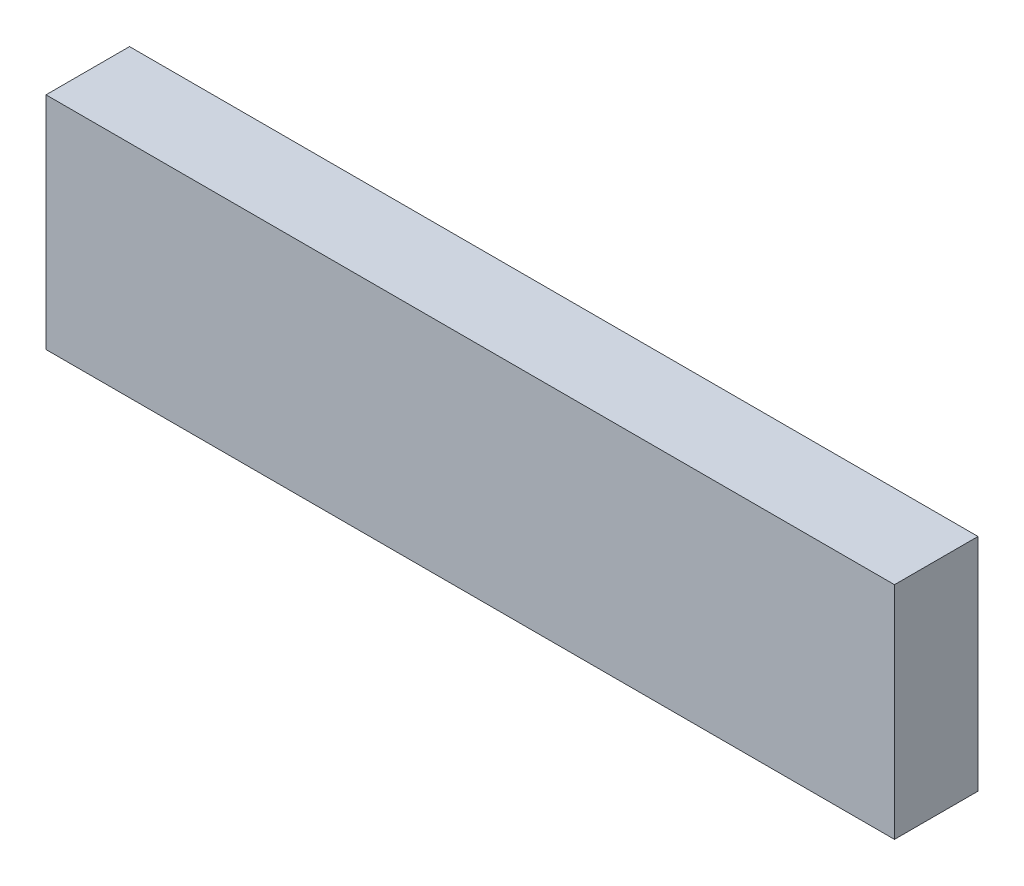
ISO-10303-21;
HEADER;
FILE_DESCRIPTION(('STEP AP214'),'2;1');
FILE_NAME('part.step','',(''),(''),'','','');
FILE_SCHEMA(('AUTOMOTIVE_DESIGN { 1 0 10303 214 1 1 1 1 }'));
ENDSEC;
DATA;
#1=APPLICATION_CONTEXT('core data for automotive mechanical design processes');
#2=APPLICATION_PROTOCOL_DEFINITION('international standard','automotive_design',2000,#1);
#3=PRODUCT_CONTEXT('',#1,'mechanical');
#4=PRODUCT('Part','Part','',(#3));
#5=PRODUCT_RELATED_PRODUCT_CATEGORY('part','',(#4));
#6=PRODUCT_DEFINITION_FORMATION('','',#4);
#7=PRODUCT_DEFINITION_CONTEXT('part definition',#1,'design');
#8=PRODUCT_DEFINITION('design','',#6,#7);
#9=PRODUCT_DEFINITION_SHAPE('','',#8);
#10=(LENGTH_UNIT() NAMED_UNIT(*) SI_UNIT(.MILLI.,.METRE.));
#11=(NAMED_UNIT(*) PLANE_ANGLE_UNIT() SI_UNIT($,.RADIAN.));
#12=(NAMED_UNIT(*) SI_UNIT($,.STERADIAN.) SOLID_ANGLE_UNIT());
#13=UNCERTAINTY_MEASURE_WITH_UNIT(LENGTH_MEASURE(1.E-05),#10,'distance_accuracy_value','');
#14=(GEOMETRIC_REPRESENTATION_CONTEXT(3) GLOBAL_UNCERTAINTY_ASSIGNED_CONTEXT((#13)) GLOBAL_UNIT_ASSIGNED_CONTEXT((#10,
#11,#12)) REPRESENTATION_CONTEXT('',''));
#15=CARTESIAN_POINT('',(0.,0.,0.));
#16=DIRECTION('',(0.,0.,1.));
#17=DIRECTION('',(1.,0.,0.));
#18=AXIS2_PLACEMENT_3D('',#15,#16,#17);
#19=CARTESIAN_POINT('',(-1.27,-1.27,1.));
#20=DIRECTION('',(1.,0.,0.));
#21=DIRECTION('',(0.,0.,-1.));
#22=AXIS2_PLACEMENT_3D('',#19,#20,#21);
#23=PLANE('',#22);
#24=DIRECTION('',(0.,-1.,0.));
#25=VECTOR('',#24,1.);
#26=CARTESIAN_POINT('',(-1.27,-1.27,0.));
#27=LINE('',#26,#25);
#28=CARTESIAN_POINT('',(-1.27,1.3716,0.));
#29=VERTEX_POINT('',#28);
#30=CARTESIAN_POINT('',(-1.27,-1.27,0.));
#31=VERTEX_POINT('',#30);
#32=EDGE_CURVE('E95',#29,#31,#27,.T.);
#33=ORIENTED_EDGE('',*,*,#32,.T.);
#34=DIRECTION('',(0.,0.,-1.));
#35=VECTOR('',#34,1.);
#36=CARTESIAN_POINT('',(-1.27,-1.27,1.));
#37=LINE('',#36,#35);
#38=CARTESIAN_POINT('',(-1.27,-1.27,1.));
#39=VERTEX_POINT('',#38);
#40=EDGE_CURVE('E11',#39,#31,#37,.T.);
#41=ORIENTED_EDGE('',*,*,#40,.F.);
#42=DIRECTION('',(0.,-1.,0.));
#43=VECTOR('',#42,1.);
#44=CARTESIAN_POINT('',(-1.27,-1.27,1.));
#45=LINE('',#44,#43);
#46=CARTESIAN_POINT('',(-1.27,1.3716,1.));
#47=VERTEX_POINT('',#46);
#48=EDGE_CURVE('E83',#47,#39,#45,.T.);
#49=ORIENTED_EDGE('',*,*,#48,.F.);
#50=DIRECTION('',(0.,0.,-1.));
#51=VECTOR('',#50,1.);
#52=CARTESIAN_POINT('',(-1.27,1.3716,1.));
#53=LINE('',#52,#51);
#54=EDGE_CURVE('E91',#47,#29,#53,.T.);
#55=ORIENTED_EDGE('',*,*,#54,.T.);
#56=EDGE_LOOP('',(#33,#41,#49,#55));
#57=FACE_BOUND('',#56,.T.);
#58=ADVANCED_FACE('F32',(#57),#23,.F.);
#59=CARTESIAN_POINT('',(8.89,-1.27,1.));
#60=DIRECTION('',(0.,1.,0.));
#61=DIRECTION('',(0.,0.,1.));
#62=AXIS2_PLACEMENT_3D('',#59,#60,#61);
#63=PLANE('',#62);
#64=DIRECTION('',(1.,0.,0.));
#65=VECTOR('',#64,1.);
#66=CARTESIAN_POINT('',(8.89,-1.27,0.));
#67=LINE('',#66,#65);
#68=CARTESIAN_POINT('',(8.89,-1.27,0.));
#69=VERTEX_POINT('',#68);
#70=EDGE_CURVE('E87',#31,#69,#67,.T.);
#71=ORIENTED_EDGE('',*,*,#70,.T.);
#72=DIRECTION('',(0.,0.,-1.));
#73=VECTOR('',#72,1.);
#74=CARTESIAN_POINT('',(8.89,-1.27,1.));
#75=LINE('',#74,#73);
#76=CARTESIAN_POINT('',(8.89,-1.27,1.));
#77=VERTEX_POINT('',#76);
#78=EDGE_CURVE('E40',#77,#69,#75,.T.);
#79=ORIENTED_EDGE('',*,*,#78,.F.);
#80=DIRECTION('',(1.,0.,0.));
#81=VECTOR('',#80,1.);
#82=CARTESIAN_POINT('',(8.89,-1.27,1.));
#83=LINE('',#82,#81);
#84=EDGE_CURVE('E78',#39,#77,#83,.T.);
#85=ORIENTED_EDGE('',*,*,#84,.F.);
#86=ORIENTED_EDGE('',*,*,#40,.T.);
#87=EDGE_LOOP('',(#71,#79,#85,#86));
#88=FACE_BOUND('',#87,.T.);
#89=ADVANCED_FACE('F86',(#88),#63,.F.);
#90=CARTESIAN_POINT('',(8.89,1.3716,1.));
#91=DIRECTION('',(-1.,0.,0.));
#92=DIRECTION('',(0.,0.,1.));
#93=AXIS2_PLACEMENT_3D('',#90,#91,#92);
#94=PLANE('',#93);
#95=DIRECTION('',(0.,1.,0.));
#96=VECTOR('',#95,1.);
#97=CARTESIAN_POINT('',(8.89,1.3716,0.));
#98=LINE('',#97,#96);
#99=CARTESIAN_POINT('',(8.89,1.3716,0.));
#100=VERTEX_POINT('',#99);
#101=EDGE_CURVE('E65',#69,#100,#98,.T.);
#102=ORIENTED_EDGE('',*,*,#101,.T.);
#103=DIRECTION('',(0.,0.,-1.));
#104=VECTOR('',#103,1.);
#105=CARTESIAN_POINT('',(8.89,1.3716,1.));
#106=LINE('',#105,#104);
#107=CARTESIAN_POINT('',(8.89,1.3716,1.));
#108=VERTEX_POINT('',#107);
#109=EDGE_CURVE('E88',#108,#100,#106,.T.);
#110=ORIENTED_EDGE('',*,*,#109,.F.);
#111=DIRECTION('',(0.,1.,0.));
#112=VECTOR('',#111,1.);
#113=CARTESIAN_POINT('',(8.89,1.3716,1.));
#114=LINE('',#113,#112);
#115=EDGE_CURVE('E81',#77,#108,#114,.T.);
#116=ORIENTED_EDGE('',*,*,#115,.F.);
#117=ORIENTED_EDGE('',*,*,#78,.T.);
#118=EDGE_LOOP('',(#102,#110,#116,#117));
#119=FACE_BOUND('',#118,.T.);
#120=ADVANCED_FACE('F89',(#119),#94,.F.);
#121=CARTESIAN_POINT('',(-1.27,1.3716,1.));
#122=DIRECTION('',(0.,-1.,0.));
#123=DIRECTION('',(0.,0.,-1.));
#124=AXIS2_PLACEMENT_3D('',#121,#122,#123);
#125=PLANE('',#124);
#126=DIRECTION('',(-1.,0.,0.));
#127=VECTOR('',#126,1.);
#128=CARTESIAN_POINT('',(-1.27,1.3716,0.));
#129=LINE('',#128,#127);
#130=EDGE_CURVE('E71',#100,#29,#129,.T.);
#131=ORIENTED_EDGE('',*,*,#130,.T.);
#132=ORIENTED_EDGE('',*,*,#54,.F.);
#133=DIRECTION('',(-1.,0.,0.));
#134=VECTOR('',#133,1.);
#135=CARTESIAN_POINT('',(-1.27,1.3716,1.));
#136=LINE('',#135,#134);
#137=EDGE_CURVE('E48',#108,#47,#136,.T.);
#138=ORIENTED_EDGE('',*,*,#137,.F.);
#139=ORIENTED_EDGE('',*,*,#109,.T.);
#140=EDGE_LOOP('',(#131,#132,#138,#139));
#141=FACE_BOUND('',#140,.T.);
#142=ADVANCED_FACE('F102',(#141),#125,.F.);
#143=CARTESIAN_POINT('',(0.,0.,1.));
#144=DIRECTION('',(0.,0.,-1.));
#145=DIRECTION('',(-1.,0.,0.));
#146=AXIS2_PLACEMENT_3D('',#143,#144,#145);
#147=PLANE('',#146);
#148=ORIENTED_EDGE('',*,*,#48,.T.);
#149=ORIENTED_EDGE('',*,*,#84,.T.);
#150=ORIENTED_EDGE('',*,*,#115,.T.);
#151=ORIENTED_EDGE('',*,*,#137,.T.);
#152=EDGE_LOOP('',(#148,#149,#150,#151));
#153=FACE_BOUND('',#152,.T.);
#154=ADVANCED_FACE('F79',(#153),#147,.F.);
#155=CARTESIAN_POINT('',(0.,0.,0.));
#156=DIRECTION('',(0.,0.,-1.));
#157=DIRECTION('',(-1.,0.,0.));
#158=AXIS2_PLACEMENT_3D('',#155,#156,#157);
#159=PLANE('',#158);
#160=ORIENTED_EDGE('',*,*,#32,.F.);
#161=ORIENTED_EDGE('',*,*,#130,.F.);
#162=ORIENTED_EDGE('',*,*,#101,.F.);
#163=ORIENTED_EDGE('',*,*,#70,.F.);
#164=EDGE_LOOP('',(#160,#161,#162,#163));
#165=FACE_BOUND('',#164,.T.);
#166=ADVANCED_FACE('F105',(#165),#159,.T.);
#167=CLOSED_SHELL('',(#58,#89,#120,#142,#154,#166));
#168=MANIFOLD_SOLID_BREP('B2',#167);
#169=ADVANCED_BREP_SHAPE_REPRESENTATION('',(#18,#168),#14);
#170=SHAPE_DEFINITION_REPRESENTATION(#9,#169);
ENDSEC;
END-ISO-10303-21;
